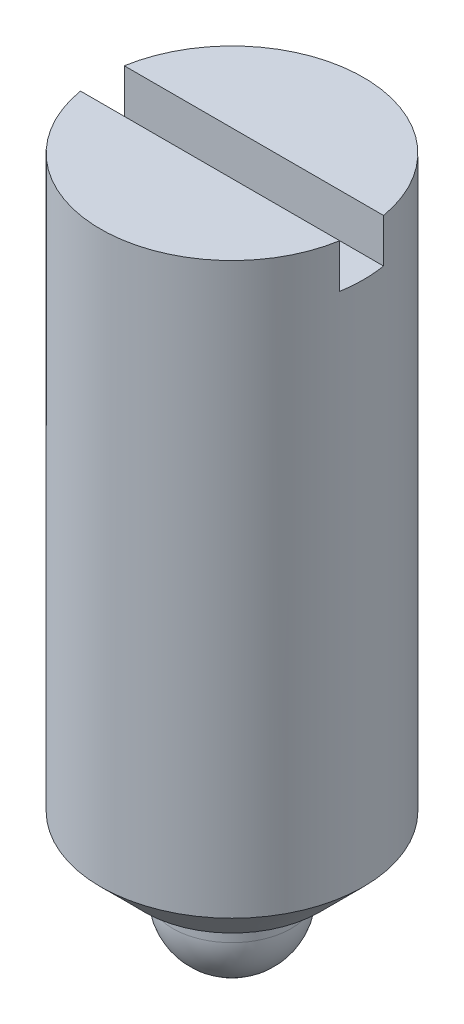
ISO-10303-21;
HEADER;
FILE_DESCRIPTION(('STEP AP214'),'2;1');
FILE_NAME('part.step','',(''),(''),'','','');
FILE_SCHEMA(('AUTOMOTIVE_DESIGN { 1 0 10303 214 1 1 1 1 }'));
ENDSEC;
DATA;
#1=APPLICATION_CONTEXT('core data for automotive mechanical design processes');
#2=APPLICATION_PROTOCOL_DEFINITION('international standard','automotive_design',2000,#1);
#3=PRODUCT_CONTEXT('',#1,'mechanical');
#4=PRODUCT('Part','Part','',(#3));
#5=PRODUCT_RELATED_PRODUCT_CATEGORY('part','',(#4));
#6=PRODUCT_DEFINITION_FORMATION('','',#4);
#7=PRODUCT_DEFINITION_CONTEXT('part definition',#1,'design');
#8=PRODUCT_DEFINITION('design','',#6,#7);
#9=PRODUCT_DEFINITION_SHAPE('','',#8);
#10=(LENGTH_UNIT() NAMED_UNIT(*) SI_UNIT(.MILLI.,.METRE.));
#11=(NAMED_UNIT(*) PLANE_ANGLE_UNIT() SI_UNIT($,.RADIAN.));
#12=(NAMED_UNIT(*) SI_UNIT($,.STERADIAN.) SOLID_ANGLE_UNIT());
#13=UNCERTAINTY_MEASURE_WITH_UNIT(LENGTH_MEASURE(1.E-05),#10,'distance_accuracy_value','');
#14=(GEOMETRIC_REPRESENTATION_CONTEXT(3) GLOBAL_UNCERTAINTY_ASSIGNED_CONTEXT((#13)) GLOBAL_UNIT_ASSIGNED_CONTEXT((#10,
#11,#12)) REPRESENTATION_CONTEXT('',''));
#15=CARTESIAN_POINT('',(0.,0.,0.));
#16=DIRECTION('',(0.,0.,1.));
#17=DIRECTION('',(1.,0.,0.));
#18=AXIS2_PLACEMENT_3D('',#15,#16,#17);
#19=CARTESIAN_POINT('',(0.,0.,0.));
#20=DIRECTION('',(0.,1.,0.));
#21=DIRECTION('',(-1.,0.,0.));
#22=AXIS2_PLACEMENT_3D('',#19,#20,#21);
#23=PLANE('',#22);
#24=DIRECTION('',(-1.,0.,0.));
#25=VECTOR('',#24,1.);
#26=CARTESIAN_POINT('',(3.47309591879065,0.,-0.5));
#27=LINE('',#26,#25);
#28=CARTESIAN_POINT('',(2.95803989154981,0.,-0.5));
#29=VERTEX_POINT('',#28);
#30=CARTESIAN_POINT('',(-2.95803989154981,0.,-0.499999999999999));
#31=VERTEX_POINT('',#30);
#32=EDGE_CURVE('E89',#29,#31,#27,.T.);
#33=ORIENTED_EDGE('',*,*,#32,.F.);
#34=CARTESIAN_POINT('',(0.,0.,0.));
#35=DIRECTION('',(0.,-1.,0.));
#36=DIRECTION('',(1.,0.,0.));
#37=AXIS2_PLACEMENT_3D('',#34,#35,#36);
#38=CIRCLE('',#37,3.);
#39=EDGE_CURVE('E96',#31,#29,#38,.T.);
#40=ORIENTED_EDGE('',*,*,#39,.F.);
#41=EDGE_LOOP('',(#33,#40));
#42=FACE_BOUND('',#41,.T.);
#43=ADVANCED_FACE('F35',(#42),#23,.T.);
#44=CARTESIAN_POINT('',(0.,-16.,0.));
#45=DIRECTION('',(0.,-1.,0.));
#46=DIRECTION('',(1.,0.,0.));
#47=AXIS2_PLACEMENT_3D('',#44,#45,#46);
#48=CYLINDRICAL_SURFACE('',#47,1.35);
#49=CARTESIAN_POINT('',(0.,-14.65,0.));
#50=DIRECTION('',(0.,-1.,0.));
#51=DIRECTION('',(1.,0.,0.));
#52=AXIS2_PLACEMENT_3D('',#49,#50,#51);
#53=CIRCLE('',#52,1.35);
#54=CARTESIAN_POINT('',(1.35,-14.65,0.));
#55=VERTEX_POINT('',#54);
#56=EDGE_CURVE('E95',#55,#55,#53,.T.);
#57=ORIENTED_EDGE('',*,*,#56,.F.);
#58=EDGE_LOOP('',(#57));
#59=FACE_BOUND('',#58,.T.);
#60=CARTESIAN_POINT('',(0.,-14.,0.));
#61=DIRECTION('',(0.,-1.,0.));
#62=DIRECTION('',(1.,0.,0.));
#63=AXIS2_PLACEMENT_3D('',#60,#61,#62);
#64=CIRCLE('',#63,1.35);
#65=CARTESIAN_POINT('',(1.35,-14.,0.));
#66=VERTEX_POINT('',#65);
#67=EDGE_CURVE('E101',#66,#66,#64,.T.);
#68=ORIENTED_EDGE('',*,*,#67,.T.);
#69=EDGE_LOOP('',(#68));
#70=FACE_BOUND('',#69,.T.);
#71=ADVANCED_FACE('F122',(#59,#70),#48,.T.);
#72=CARTESIAN_POINT('',(0.,-14.65,0.));
#73=DIRECTION('',(0.,-1.,0.));
#74=DIRECTION('',(-1.,0.,0.));
#75=AXIS2_PLACEMENT_3D('',#72,#73,#74);
#76=SPHERICAL_SURFACE('',#75,1.35);
#77=ORIENTED_EDGE('',*,*,#56,.T.);
#78=EDGE_LOOP('',(#77));
#79=FACE_BOUND('',#78,.T.);
#80=ADVANCED_FACE('F127',(#79),#76,.T.);
#81=DIRECTION('',(1.,0.,0.));
#82=VECTOR('',#81,1.);
#83=CARTESIAN_POINT('',(3.47309591879065,0.,0.5));
#84=LINE('',#83,#82);
#85=CARTESIAN_POINT('',(-2.95803989154981,0.,0.5));
#86=VERTEX_POINT('',#85);
#87=CARTESIAN_POINT('',(2.95803989154981,0.,0.5));
#88=VERTEX_POINT('',#87);
#89=EDGE_CURVE('E77',#86,#88,#84,.T.);
#90=ORIENTED_EDGE('',*,*,#89,.F.);
#91=EDGE_CURVE('E88',#88,#86,#38,.T.);
#92=ORIENTED_EDGE('',*,*,#91,.F.);
#93=EDGE_LOOP('',(#90,#92));
#94=FACE_BOUND('',#93,.T.);
#95=ADVANCED_FACE('F87',(#94),#23,.T.);
#96=CARTESIAN_POINT('',(0.,-16.,0.));
#97=DIRECTION('',(0.,-1.,0.));
#98=DIRECTION('',(1.,0.,0.));
#99=AXIS2_PLACEMENT_3D('',#96,#97,#98);
#100=CYLINDRICAL_SURFACE('',#99,3.);
#101=ORIENTED_EDGE('',*,*,#39,.T.);
#102=DIRECTION('',(0.,-1.,0.));
#103=VECTOR('',#102,1.);
#104=CARTESIAN_POINT('',(2.95803989154981,-16.,-0.5));
#105=LINE('',#104,#103);
#106=CARTESIAN_POINT('',(2.95803989154981,-1.,-0.5));
#107=VERTEX_POINT('',#106);
#108=EDGE_CURVE('E11',#29,#107,#105,.T.);
#109=ORIENTED_EDGE('',*,*,#108,.T.);
#110=CARTESIAN_POINT('',(0.,-1.,0.));
#111=DIRECTION('',(0.,1.,0.));
#112=DIRECTION('',(-1.,0.,0.));
#113=AXIS2_PLACEMENT_3D('',#110,#111,#112);
#114=CIRCLE('',#113,3.);
#115=CARTESIAN_POINT('',(2.95803989154981,-1.,0.5));
#116=VERTEX_POINT('',#115);
#117=EDGE_CURVE('E110',#116,#107,#114,.T.);
#118=ORIENTED_EDGE('',*,*,#117,.F.);
#119=DIRECTION('',(0.,-1.,0.));
#120=VECTOR('',#119,1.);
#121=CARTESIAN_POINT('',(2.95803989154981,-16.,0.5));
#122=LINE('',#121,#120);
#123=EDGE_CURVE('E43',#116,#88,#122,.F.);
#124=ORIENTED_EDGE('',*,*,#123,.T.);
#125=ORIENTED_EDGE('',*,*,#91,.T.);
#126=DIRECTION('',(0.,-1.,0.));
#127=VECTOR('',#126,1.);
#128=CARTESIAN_POINT('',(-2.95803989154981,-16.,0.5));
#129=LINE('',#128,#127);
#130=CARTESIAN_POINT('',(-2.95803989154981,-1.,0.5));
#131=VERTEX_POINT('',#130);
#132=EDGE_CURVE('E74',#86,#131,#129,.T.);
#133=ORIENTED_EDGE('',*,*,#132,.T.);
#134=CARTESIAN_POINT('',(-2.95803989154981,-1.,-0.499999999999999));
#135=VERTEX_POINT('',#134);
#136=EDGE_CURVE('E83',#135,#131,#114,.T.);
#137=ORIENTED_EDGE('',*,*,#136,.F.);
#138=DIRECTION('',(0.,-1.,0.));
#139=VECTOR('',#138,1.);
#140=CARTESIAN_POINT('',(-2.95803989154981,-16.,-0.5));
#141=LINE('',#140,#139);
#142=EDGE_CURVE('E82',#135,#31,#141,.F.);
#143=ORIENTED_EDGE('',*,*,#142,.T.);
#144=EDGE_LOOP('',(#101,#109,#118,#124,#125,#133,#137,#143));
#145=FACE_BOUND('',#144,.T.);
#146=CARTESIAN_POINT('',(0.,-13.,0.));
#147=DIRECTION('',(0.,-1.,0.));
#148=DIRECTION('',(1.,0.,0.));
#149=AXIS2_PLACEMENT_3D('',#146,#147,#148);
#150=CIRCLE('',#149,3.);
#151=CARTESIAN_POINT('',(3.,-13.,0.));
#152=VERTEX_POINT('',#151);
#153=EDGE_CURVE('E107',#152,#152,#150,.F.);
#154=ORIENTED_EDGE('',*,*,#153,.T.);
#155=EDGE_LOOP('',(#154));
#156=FACE_BOUND('',#155,.T.);
#157=ADVANCED_FACE('F92',(#145,#156),#100,.T.);
#158=CARTESIAN_POINT('',(0.,-14.,0.));
#159=DIRECTION('',(0.,-1.,0.));
#160=DIRECTION('',(1.,0.,0.));
#161=AXIS2_PLACEMENT_3D('',#158,#159,#160);
#162=PLANE('',#161);
#163=CARTESIAN_POINT('',(0.,-14.,0.));
#164=DIRECTION('',(0.,-1.,0.));
#165=DIRECTION('',(1.,0.,0.));
#166=AXIS2_PLACEMENT_3D('',#163,#164,#165);
#167=CIRCLE('',#166,2.);
#168=CARTESIAN_POINT('',(2.,-14.,0.));
#169=VERTEX_POINT('',#168);
#170=EDGE_CURVE('E99',#169,#169,#167,.T.);
#171=ORIENTED_EDGE('',*,*,#170,.T.);
#172=EDGE_LOOP('',(#171));
#173=FACE_BOUND('',#172,.T.);
#174=ORIENTED_EDGE('',*,*,#67,.F.);
#175=EDGE_LOOP('',(#174));
#176=FACE_BOUND('',#175,.T.);
#177=ADVANCED_FACE('F136',(#173,#176),#162,.T.);
#178=CARTESIAN_POINT('',(0.,-14.,0.));
#179=DIRECTION('',(0.,1.,0.));
#180=DIRECTION('',(-1.,0.,0.));
#181=AXIS2_PLACEMENT_3D('',#178,#179,#180);
#182=CONICAL_SURFACE('',#181,2.,0.785398163397446);
#183=ORIENTED_EDGE('',*,*,#153,.F.);
#184=EDGE_LOOP('',(#183));
#185=FACE_BOUND('',#184,.T.);
#186=ORIENTED_EDGE('',*,*,#170,.F.);
#187=EDGE_LOOP('',(#186));
#188=FACE_BOUND('',#187,.T.);
#189=ADVANCED_FACE('F37',(#185,#188),#182,.T.);
#190=CARTESIAN_POINT('',(3.47309591879065,-1.,-0.5));
#191=DIRECTION('',(0.,0.,-1.));
#192=DIRECTION('',(-1.,0.,0.));
#193=AXIS2_PLACEMENT_3D('',#190,#191,#192);
#194=PLANE('',#193);
#195=ORIENTED_EDGE('',*,*,#32,.T.);
#196=ORIENTED_EDGE('',*,*,#142,.F.);
#197=DIRECTION('',(-1.,0.,0.));
#198=VECTOR('',#197,1.);
#199=CARTESIAN_POINT('',(3.47309591879065,-1.,-0.5));
#200=LINE('',#199,#198);
#201=EDGE_CURVE('E50',#107,#135,#200,.T.);
#202=ORIENTED_EDGE('',*,*,#201,.F.);
#203=ORIENTED_EDGE('',*,*,#108,.F.);
#204=EDGE_LOOP('',(#195,#196,#202,#203));
#205=FACE_BOUND('',#204,.T.);
#206=ADVANCED_FACE('F115',(#205),#194,.F.);
#207=CARTESIAN_POINT('',(3.47309591879065,-1.,0.5));
#208=DIRECTION('',(0.,0.,1.));
#209=DIRECTION('',(1.,0.,0.));
#210=AXIS2_PLACEMENT_3D('',#207,#208,#209);
#211=PLANE('',#210);
#212=ORIENTED_EDGE('',*,*,#89,.T.);
#213=ORIENTED_EDGE('',*,*,#123,.F.);
#214=DIRECTION('',(1.,0.,0.));
#215=VECTOR('',#214,1.);
#216=CARTESIAN_POINT('',(3.47309591879065,-1.,0.5));
#217=LINE('',#216,#215);
#218=EDGE_CURVE('E78',#131,#116,#217,.T.);
#219=ORIENTED_EDGE('',*,*,#218,.F.);
#220=ORIENTED_EDGE('',*,*,#132,.F.);
#221=EDGE_LOOP('',(#212,#213,#219,#220));
#222=FACE_BOUND('',#221,.T.);
#223=ADVANCED_FACE('F76',(#222),#211,.F.);
#224=CARTESIAN_POINT('',(0.,-1.,0.));
#225=DIRECTION('',(0.,1.,0.));
#226=DIRECTION('',(-1.,0.,0.));
#227=AXIS2_PLACEMENT_3D('',#224,#225,#226);
#228=PLANE('',#227);
#229=ORIENTED_EDGE('',*,*,#117,.T.);
#230=ORIENTED_EDGE('',*,*,#201,.T.);
#231=ORIENTED_EDGE('',*,*,#136,.T.);
#232=ORIENTED_EDGE('',*,*,#218,.T.);
#233=EDGE_LOOP('',(#229,#230,#231,#232));
#234=FACE_BOUND('',#233,.T.);
#235=ADVANCED_FACE('F113',(#234),#228,.T.);
#236=CLOSED_SHELL('',(#43,#71,#80,#95,#157,#177,#189,#206,#223,#235));
#237=MANIFOLD_SOLID_BREP('B2',#236);
#238=ADVANCED_BREP_SHAPE_REPRESENTATION('',(#18,#237),#14);
#239=SHAPE_DEFINITION_REPRESENTATION(#9,#238);
ENDSEC;
END-ISO-10303-21;
